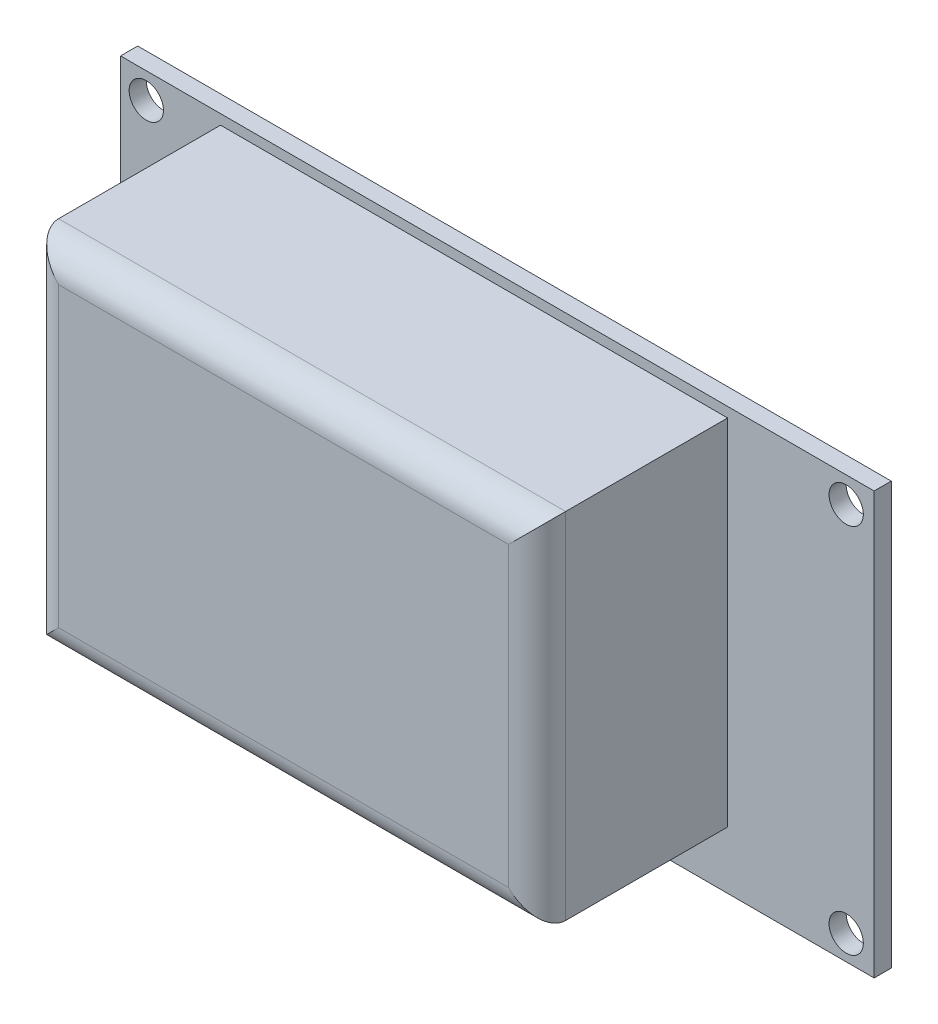
ISO-10303-21;
HEADER;
FILE_DESCRIPTION(('STEP AP214'),'2;1');
FILE_NAME('part.step','',(''),(''),'','','');
FILE_SCHEMA(('AUTOMOTIVE_DESIGN { 1 0 10303 214 1 1 1 1 }'));
ENDSEC;
DATA;
#1=APPLICATION_CONTEXT('core data for automotive mechanical design processes');
#2=APPLICATION_PROTOCOL_DEFINITION('international standard','automotive_design',2000,#1);
#3=PRODUCT_CONTEXT('',#1,'mechanical');
#4=PRODUCT('Part','Part','',(#3));
#5=PRODUCT_RELATED_PRODUCT_CATEGORY('part','',(#4));
#6=PRODUCT_DEFINITION_FORMATION('','',#4);
#7=PRODUCT_DEFINITION_CONTEXT('part definition',#1,'design');
#8=PRODUCT_DEFINITION('design','',#6,#7);
#9=PRODUCT_DEFINITION_SHAPE('','',#8);
#10=(LENGTH_UNIT() NAMED_UNIT(*) SI_UNIT(.MILLI.,.METRE.));
#11=(NAMED_UNIT(*) PLANE_ANGLE_UNIT() SI_UNIT($,.RADIAN.));
#12=(NAMED_UNIT(*) SI_UNIT($,.STERADIAN.) SOLID_ANGLE_UNIT());
#13=UNCERTAINTY_MEASURE_WITH_UNIT(LENGTH_MEASURE(1.E-05),#10,'distance_accuracy_value','');
#14=(GEOMETRIC_REPRESENTATION_CONTEXT(3) GLOBAL_UNCERTAINTY_ASSIGNED_CONTEXT((#13)) GLOBAL_UNIT_ASSIGNED_CONTEXT((#10,
#11,#12)) REPRESENTATION_CONTEXT('',''));
#15=CARTESIAN_POINT('',(0.,0.,0.));
#16=DIRECTION('',(0.,0.,1.));
#17=DIRECTION('',(1.,0.,0.));
#18=AXIS2_PLACEMENT_3D('',#15,#16,#17);
#19=CARTESIAN_POINT('',(-33.5,-18.749999965,1.524));
#20=DIRECTION('',(0.,0.,1.));
#21=DIRECTION('',(1.,0.,0.));
#22=AXIS2_PLACEMENT_3D('',#19,#20,#21);
#23=PLANE('',#22);
#24=DIRECTION('',(0.,-1.,0.));
#25=VECTOR('',#24,1.);
#26=CARTESIAN_POINT('',(-33.5,18.749999965,1.524));
#27=LINE('',#26,#25);
#28=CARTESIAN_POINT('',(-33.5,18.749999965,1.524));
#29=VERTEX_POINT('',#28);
#30=CARTESIAN_POINT('',(-33.5,-18.749999965,1.524));
#31=VERTEX_POINT('',#30);
#32=EDGE_CURVE('E169',#29,#31,#27,.T.);
#33=ORIENTED_EDGE('',*,*,#32,.T.);
#34=DIRECTION('',(1.,0.,0.));
#35=VECTOR('',#34,1.);
#36=CARTESIAN_POINT('',(-33.5,-18.749999965,1.524));
#37=LINE('',#36,#35);
#38=CARTESIAN_POINT('',(33.5,-18.749999965,1.524));
#39=VERTEX_POINT('',#38);
#40=EDGE_CURVE('E172',#31,#39,#37,.T.);
#41=ORIENTED_EDGE('',*,*,#40,.T.);
#42=DIRECTION('',(0.,1.,0.));
#43=VECTOR('',#42,1.);
#44=CARTESIAN_POINT('',(33.5,18.749999965,1.524));
#45=LINE('',#44,#43);
#46=CARTESIAN_POINT('',(33.5,18.749999965,1.524));
#47=VERTEX_POINT('',#46);
#48=EDGE_CURVE('E175',#39,#47,#45,.T.);
#49=ORIENTED_EDGE('',*,*,#48,.T.);
#50=DIRECTION('',(-1.,0.,0.));
#51=VECTOR('',#50,1.);
#52=CARTESIAN_POINT('',(-33.5,18.749999965,1.524));
#53=LINE('',#52,#51);
#54=EDGE_CURVE('E177',#47,#29,#53,.T.);
#55=ORIENTED_EDGE('',*,*,#54,.T.);
#56=EDGE_LOOP('',(#33,#41,#49,#55));
#57=FACE_BOUND('',#56,.T.);
#58=CARTESIAN_POINT('',(-31.214,16.463999965,1.524));
#59=DIRECTION('',(0.,0.,1.));
#60=DIRECTION('',(1.,0.,0.));
#61=AXIS2_PLACEMENT_3D('',#58,#59,#60);
#62=CIRCLE('',#61,1.524);
#63=CARTESIAN_POINT('',(-29.69,16.463999965,1.524));
#64=VERTEX_POINT('',#63);
#65=EDGE_CURVE('E160',#64,#64,#62,.T.);
#66=ORIENTED_EDGE('',*,*,#65,.F.);
#67=EDGE_LOOP('',(#66));
#68=FACE_BOUND('',#67,.T.);
#69=CARTESIAN_POINT('',(31.016,16.463999965,1.524));
#70=DIRECTION('',(0.,0.,1.));
#71=DIRECTION('',(1.,0.,0.));
#72=AXIS2_PLACEMENT_3D('',#69,#70,#71);
#73=CIRCLE('',#72,1.524);
#74=CARTESIAN_POINT('',(32.54,16.463999965,1.524));
#75=VERTEX_POINT('',#74);
#76=EDGE_CURVE('E154',#75,#75,#73,.T.);
#77=ORIENTED_EDGE('',*,*,#76,.F.);
#78=EDGE_LOOP('',(#77));
#79=FACE_BOUND('',#78,.T.);
#80=CARTESIAN_POINT('',(-31.2139999999996,-16.556000035,1.524));
#81=DIRECTION('',(0.,0.,1.));
#82=DIRECTION('',(1.,0.,0.));
#83=AXIS2_PLACEMENT_3D('',#80,#81,#82);
#84=CIRCLE('',#83,1.524);
#85=CARTESIAN_POINT('',(-29.6899999999996,-16.556000035,1.524));
#86=VERTEX_POINT('',#85);
#87=EDGE_CURVE('E148',#86,#86,#84,.T.);
#88=ORIENTED_EDGE('',*,*,#87,.F.);
#89=EDGE_LOOP('',(#88));
#90=FACE_BOUND('',#89,.T.);
#91=CARTESIAN_POINT('',(31.0160000000004,-16.556000035,1.524));
#92=DIRECTION('',(0.,0.,1.));
#93=DIRECTION('',(1.,0.,0.));
#94=AXIS2_PLACEMENT_3D('',#91,#92,#93);
#95=CIRCLE('',#94,1.524);
#96=CARTESIAN_POINT('',(32.5400000000004,-16.556000035,1.524));
#97=VERTEX_POINT('',#96);
#98=EDGE_CURVE('E123',#97,#97,#95,.T.);
#99=ORIENTED_EDGE('',*,*,#98,.F.);
#100=EDGE_LOOP('',(#99));
#101=FACE_BOUND('',#100,.T.);
#102=DIRECTION('',(1.,0.,0.));
#103=VECTOR('',#102,1.);
#104=CARTESIAN_POINT('',(-24.61,-13.635000035,1.524));
#105=LINE('',#104,#103);
#106=CARTESIAN_POINT('',(-24.61,-13.635000035,1.524));
#107=VERTEX_POINT('',#106);
#108=CARTESIAN_POINT('',(20.475,-13.635000035,1.524));
#109=VERTEX_POINT('',#108);
#110=EDGE_CURVE('E116',#107,#109,#105,.T.);
#111=ORIENTED_EDGE('',*,*,#110,.F.);
#112=DIRECTION('',(0.,-1.,0.));
#113=VECTOR('',#112,1.);
#114=CARTESIAN_POINT('',(-24.61,17.860999965,1.524));
#115=LINE('',#114,#113);
#116=CARTESIAN_POINT('',(-24.61,17.860999965,1.524));
#117=VERTEX_POINT('',#116);
#118=EDGE_CURVE('E127',#117,#107,#115,.T.);
#119=ORIENTED_EDGE('',*,*,#118,.F.);
#120=DIRECTION('',(-1.,0.,0.));
#121=VECTOR('',#120,1.);
#122=CARTESIAN_POINT('',(-24.61,17.860999965,1.524));
#123=LINE('',#122,#121);
#124=CARTESIAN_POINT('',(20.475,17.860999965,1.524));
#125=VERTEX_POINT('',#124);
#126=EDGE_CURVE('E137',#125,#117,#123,.T.);
#127=ORIENTED_EDGE('',*,*,#126,.F.);
#128=DIRECTION('',(0.,1.,0.));
#129=VECTOR('',#128,1.);
#130=CARTESIAN_POINT('',(20.475,17.860999965,1.524));
#131=LINE('',#130,#129);
#132=EDGE_CURVE('E135',#109,#125,#131,.T.);
#133=ORIENTED_EDGE('',*,*,#132,.F.);
#134=EDGE_LOOP('',(#111,#119,#127,#133));
#135=FACE_BOUND('',#134,.T.);
#136=ADVANCED_FACE('F35',(#57,#68,#79,#90,#101,#135),#23,.T.);
#137=CARTESIAN_POINT('',(-33.5,18.749999965,1.524));
#138=DIRECTION('',(1.,0.,0.));
#139=DIRECTION('',(0.,1.,0.));
#140=AXIS2_PLACEMENT_3D('',#137,#138,#139);
#141=PLANE('',#140);
#142=DIRECTION('',(0.,-1.,0.));
#143=VECTOR('',#142,1.);
#144=CARTESIAN_POINT('',(-33.5,18.749999965,0.));
#145=LINE('',#144,#143);
#146=CARTESIAN_POINT('',(-33.5,18.749999965,0.));
#147=VERTEX_POINT('',#146);
#148=CARTESIAN_POINT('',(-33.5,-18.749999965,0.));
#149=VERTEX_POINT('',#148);
#150=EDGE_CURVE('E166',#147,#149,#145,.T.);
#151=ORIENTED_EDGE('',*,*,#150,.T.);
#152=DIRECTION('',(0.,0.,-1.));
#153=VECTOR('',#152,1.);
#154=CARTESIAN_POINT('',(-33.5,-18.749999965,1.524));
#155=LINE('',#154,#153);
#156=EDGE_CURVE('E195',#31,#149,#155,.T.);
#157=ORIENTED_EDGE('',*,*,#156,.F.);
#158=ORIENTED_EDGE('',*,*,#32,.F.);
#159=DIRECTION('',(0.,0.,-1.));
#160=VECTOR('',#159,1.);
#161=CARTESIAN_POINT('',(-33.5,18.749999965,1.524));
#162=LINE('',#161,#160);
#163=EDGE_CURVE('E179',#29,#147,#162,.T.);
#164=ORIENTED_EDGE('',*,*,#163,.T.);
#165=EDGE_LOOP('',(#151,#157,#158,#164));
#166=FACE_BOUND('',#165,.T.);
#167=ADVANCED_FACE('F244',(#166),#141,.F.);
#168=CARTESIAN_POINT('',(-33.5,-18.749999965,1.524));
#169=DIRECTION('',(0.,1.,0.));
#170=DIRECTION('',(-1.,0.,0.));
#171=AXIS2_PLACEMENT_3D('',#168,#169,#170);
#172=PLANE('',#171);
#173=DIRECTION('',(1.,0.,0.));
#174=VECTOR('',#173,1.);
#175=CARTESIAN_POINT('',(-33.5,-18.749999965,0.));
#176=LINE('',#175,#174);
#177=CARTESIAN_POINT('',(33.5,-18.749999965,0.));
#178=VERTEX_POINT('',#177);
#179=EDGE_CURVE('E182',#149,#178,#176,.T.);
#180=ORIENTED_EDGE('',*,*,#179,.T.);
#181=DIRECTION('',(0.,0.,-1.));
#182=VECTOR('',#181,1.);
#183=CARTESIAN_POINT('',(33.5,-18.749999965,1.524));
#184=LINE('',#183,#182);
#185=EDGE_CURVE('E192',#39,#178,#184,.T.);
#186=ORIENTED_EDGE('',*,*,#185,.F.);
#187=ORIENTED_EDGE('',*,*,#40,.F.);
#188=ORIENTED_EDGE('',*,*,#156,.T.);
#189=EDGE_LOOP('',(#180,#186,#187,#188));
#190=FACE_BOUND('',#189,.T.);
#191=ADVANCED_FACE('F250',(#190),#172,.F.);
#192=CARTESIAN_POINT('',(33.5,18.749999965,1.524));
#193=DIRECTION('',(-1.,0.,0.));
#194=DIRECTION('',(0.,0.,1.));
#195=AXIS2_PLACEMENT_3D('',#192,#193,#194);
#196=PLANE('',#195);
#197=DIRECTION('',(0.,1.,0.));
#198=VECTOR('',#197,1.);
#199=CARTESIAN_POINT('',(33.5,18.749999965,0.));
#200=LINE('',#199,#198);
#201=CARTESIAN_POINT('',(33.5,18.749999965,0.));
#202=VERTEX_POINT('',#201);
#203=EDGE_CURVE('E184',#178,#202,#200,.T.);
#204=ORIENTED_EDGE('',*,*,#203,.T.);
#205=DIRECTION('',(0.,0.,-1.));
#206=VECTOR('',#205,1.);
#207=CARTESIAN_POINT('',(33.5,18.749999965,1.524));
#208=LINE('',#207,#206);
#209=EDGE_CURVE('E189',#47,#202,#208,.T.);
#210=ORIENTED_EDGE('',*,*,#209,.F.);
#211=ORIENTED_EDGE('',*,*,#48,.F.);
#212=ORIENTED_EDGE('',*,*,#185,.T.);
#213=EDGE_LOOP('',(#204,#210,#211,#212));
#214=FACE_BOUND('',#213,.T.);
#215=ADVANCED_FACE('F265',(#214),#196,.F.);
#216=CARTESIAN_POINT('',(-33.5,18.749999965,1.524));
#217=DIRECTION('',(0.,-1.,0.));
#218=DIRECTION('',(1.,0.,0.));
#219=AXIS2_PLACEMENT_3D('',#216,#217,#218);
#220=PLANE('',#219);
#221=DIRECTION('',(-1.,0.,0.));
#222=VECTOR('',#221,1.);
#223=CARTESIAN_POINT('',(-33.5,18.749999965,0.));
#224=LINE('',#223,#222);
#225=EDGE_CURVE('E173',#202,#147,#224,.T.);
#226=ORIENTED_EDGE('',*,*,#225,.T.);
#227=ORIENTED_EDGE('',*,*,#163,.F.);
#228=ORIENTED_EDGE('',*,*,#54,.F.);
#229=ORIENTED_EDGE('',*,*,#209,.T.);
#230=EDGE_LOOP('',(#226,#227,#228,#229));
#231=FACE_BOUND('',#230,.T.);
#232=ADVANCED_FACE('F261',(#231),#220,.F.);
#233=CARTESIAN_POINT('',(-33.5,-18.749999965,0.));
#234=DIRECTION('',(0.,0.,1.));
#235=DIRECTION('',(1.,0.,0.));
#236=AXIS2_PLACEMENT_3D('',#233,#234,#235);
#237=PLANE('',#236);
#238=CARTESIAN_POINT('',(31.0160000000004,-16.556000035,0.));
#239=DIRECTION('',(0.,0.,1.));
#240=DIRECTION('',(1.,0.,0.));
#241=AXIS2_PLACEMENT_3D('',#238,#239,#240);
#242=CIRCLE('',#241,1.524);
#243=CARTESIAN_POINT('',(32.5400000000004,-16.556000035,0.));
#244=VERTEX_POINT('',#243);
#245=EDGE_CURVE('E145',#244,#244,#242,.T.);
#246=ORIENTED_EDGE('',*,*,#245,.T.);
#247=EDGE_LOOP('',(#246));
#248=FACE_BOUND('',#247,.T.);
#249=CARTESIAN_POINT('',(-31.2139999999996,-16.556000035,0.));
#250=DIRECTION('',(0.,0.,1.));
#251=DIRECTION('',(1.,0.,0.));
#252=AXIS2_PLACEMENT_3D('',#249,#250,#251);
#253=CIRCLE('',#252,1.524);
#254=CARTESIAN_POINT('',(-29.6899999999996,-16.556000035,0.));
#255=VERTEX_POINT('',#254);
#256=EDGE_CURVE('E151',#255,#255,#253,.T.);
#257=ORIENTED_EDGE('',*,*,#256,.T.);
#258=EDGE_LOOP('',(#257));
#259=FACE_BOUND('',#258,.T.);
#260=CARTESIAN_POINT('',(31.016,16.463999965,0.));
#261=DIRECTION('',(0.,0.,1.));
#262=DIRECTION('',(1.,0.,0.));
#263=AXIS2_PLACEMENT_3D('',#260,#261,#262);
#264=CIRCLE('',#263,1.524);
#265=CARTESIAN_POINT('',(32.54,16.463999965,0.));
#266=VERTEX_POINT('',#265);
#267=EDGE_CURVE('E157',#266,#266,#264,.T.);
#268=ORIENTED_EDGE('',*,*,#267,.T.);
#269=EDGE_LOOP('',(#268));
#270=FACE_BOUND('',#269,.T.);
#271=CARTESIAN_POINT('',(-31.214,16.463999965,0.));
#272=DIRECTION('',(0.,0.,1.));
#273=DIRECTION('',(1.,0.,0.));
#274=AXIS2_PLACEMENT_3D('',#271,#272,#273);
#275=CIRCLE('',#274,1.524);
#276=CARTESIAN_POINT('',(-29.69,16.463999965,0.));
#277=VERTEX_POINT('',#276);
#278=EDGE_CURVE('E163',#277,#277,#275,.T.);
#279=ORIENTED_EDGE('',*,*,#278,.T.);
#280=EDGE_LOOP('',(#279));
#281=FACE_BOUND('',#280,.T.);
#282=ORIENTED_EDGE('',*,*,#150,.F.);
#283=ORIENTED_EDGE('',*,*,#225,.F.);
#284=ORIENTED_EDGE('',*,*,#203,.F.);
#285=ORIENTED_EDGE('',*,*,#179,.F.);
#286=EDGE_LOOP('',(#282,#283,#284,#285));
#287=FACE_BOUND('',#286,.T.);
#288=ADVANCED_FACE('F258',(#248,#259,#270,#281,#287),#237,.F.);
#289=CARTESIAN_POINT('',(-31.214,16.463999965,0.));
#290=DIRECTION('',(0.,0.,1.));
#291=DIRECTION('',(1.,0.,0.));
#292=AXIS2_PLACEMENT_3D('',#289,#290,#291);
#293=CYLINDRICAL_SURFACE('',#292,1.524);
#294=CARTESIAN_POINT('',(-29.69,16.463999965,0.));
#295=CARTESIAN_POINT('',(-29.69,16.463999965,0.015875));
#296=CARTESIAN_POINT('',(-29.69,16.463999965,0.03175));
#297=CARTESIAN_POINT('',(-29.69,16.463999965,0.0635));
#298=CARTESIAN_POINT('',(-29.69,16.463999965,0.079375));
#299=CARTESIAN_POINT('',(-29.69,16.463999965,0.111125));
#300=CARTESIAN_POINT('',(-29.69,16.463999965,0.127));
#301=CARTESIAN_POINT('',(-29.69,16.463999965,0.15875));
#302=CARTESIAN_POINT('',(-29.69,16.463999965,0.174625));
#303=CARTESIAN_POINT('',(-29.69,16.463999965,0.206375));
#304=CARTESIAN_POINT('',(-29.69,16.463999965,0.22225));
#305=CARTESIAN_POINT('',(-29.69,16.463999965,0.254));
#306=CARTESIAN_POINT('',(-29.69,16.463999965,0.269875));
#307=CARTESIAN_POINT('',(-29.69,16.463999965,0.301625));
#308=CARTESIAN_POINT('',(-29.69,16.463999965,0.3175));
#309=CARTESIAN_POINT('',(-29.69,16.463999965,0.34925));
#310=CARTESIAN_POINT('',(-29.69,16.463999965,0.365125));
#311=CARTESIAN_POINT('',(-29.69,16.463999965,0.396875));
#312=CARTESIAN_POINT('',(-29.69,16.463999965,0.41275));
#313=CARTESIAN_POINT('',(-29.69,16.463999965,0.4445));
#314=CARTESIAN_POINT('',(-29.69,16.463999965,0.460375));
#315=CARTESIAN_POINT('',(-29.69,16.463999965,0.492125));
#316=CARTESIAN_POINT('',(-29.69,16.463999965,0.508));
#317=CARTESIAN_POINT('',(-29.69,16.463999965,0.53975));
#318=CARTESIAN_POINT('',(-29.69,16.463999965,0.555625));
#319=CARTESIAN_POINT('',(-29.69,16.463999965,0.587375));
#320=CARTESIAN_POINT('',(-29.69,16.463999965,0.60325));
#321=CARTESIAN_POINT('',(-29.69,16.463999965,0.635));
#322=CARTESIAN_POINT('',(-29.69,16.463999965,0.650875));
#323=CARTESIAN_POINT('',(-29.69,16.463999965,0.682625));
#324=CARTESIAN_POINT('',(-29.69,16.463999965,0.6985));
#325=CARTESIAN_POINT('',(-29.69,16.463999965,0.73025));
#326=CARTESIAN_POINT('',(-29.69,16.463999965,0.746125));
#327=CARTESIAN_POINT('',(-29.69,16.463999965,0.777875));
#328=CARTESIAN_POINT('',(-29.69,16.463999965,0.79375));
#329=CARTESIAN_POINT('',(-29.69,16.463999965,0.8255));
#330=CARTESIAN_POINT('',(-29.69,16.463999965,0.841375));
#331=CARTESIAN_POINT('',(-29.69,16.463999965,0.873125));
#332=CARTESIAN_POINT('',(-29.69,16.463999965,0.889));
#333=CARTESIAN_POINT('',(-29.69,16.463999965,0.92075));
#334=CARTESIAN_POINT('',(-29.69,16.463999965,0.936625));
#335=CARTESIAN_POINT('',(-29.69,16.463999965,0.968375));
#336=CARTESIAN_POINT('',(-29.69,16.463999965,0.98425));
#337=CARTESIAN_POINT('',(-29.69,16.463999965,1.016));
#338=CARTESIAN_POINT('',(-29.69,16.463999965,1.031875));
#339=CARTESIAN_POINT('',(-29.69,16.463999965,1.063625));
#340=CARTESIAN_POINT('',(-29.69,16.463999965,1.0795));
#341=CARTESIAN_POINT('',(-29.69,16.463999965,1.11125));
#342=CARTESIAN_POINT('',(-29.69,16.463999965,1.127125));
#343=CARTESIAN_POINT('',(-29.69,16.463999965,1.158875));
#344=CARTESIAN_POINT('',(-29.69,16.463999965,1.17475));
#345=CARTESIAN_POINT('',(-29.69,16.463999965,1.2065));
#346=CARTESIAN_POINT('',(-29.69,16.463999965,1.222375));
#347=CARTESIAN_POINT('',(-29.69,16.463999965,1.254125));
#348=CARTESIAN_POINT('',(-29.69,16.463999965,1.27));
#349=CARTESIAN_POINT('',(-29.69,16.463999965,1.30175));
#350=CARTESIAN_POINT('',(-29.69,16.463999965,1.317625));
#351=CARTESIAN_POINT('',(-29.69,16.463999965,1.349375));
#352=CARTESIAN_POINT('',(-29.69,16.463999965,1.36525));
#353=CARTESIAN_POINT('',(-29.69,16.463999965,1.397));
#354=CARTESIAN_POINT('',(-29.69,16.463999965,1.412875));
#355=CARTESIAN_POINT('',(-29.69,16.463999965,1.444625));
#356=CARTESIAN_POINT('',(-29.69,16.463999965,1.4605));
#357=CARTESIAN_POINT('',(-29.69,16.463999965,1.49225));
#358=CARTESIAN_POINT('',(-29.69,16.463999965,1.508125));
#359=CARTESIAN_POINT('',(-29.69,16.463999965,1.524));
#360=B_SPLINE_CURVE_WITH_KNOTS('',3,(#294,#295,#296,#297,#298,#299,#300,#301,#302,#303,#304,
#305,#306,#307,#308,#309,#310,#311,#312,#313,#314,#315,#316,#317,#318,#319,#320,#321,#322,#323,
#324,#325,#326,#327,#328,#329,#330,#331,#332,#333,#334,#335,#336,#337,#338,#339,#340,#341,#342,
#343,#344,#345,#346,#347,#348,#349,#350,#351,#352,#353,#354,#355,#356,#357,#358,#359),
.UNSPECIFIED.,.F.,.F.,(4,2,2,2,2,2,2,2,2,2,2,2,2,2,2,2,2,2,2,2,2,2,2,2,2,2,2,2,2,2,2,2,4),(0.,
0.047625,0.09525,0.142875,0.1905,0.238125,0.28575,0.333375,0.381,0.428625,0.47625,0.523875,
0.5715,0.619125,0.66675,0.714375,0.762,0.809625,0.85725,0.904875,0.9525,1.000125,1.04775,
1.095375,1.143,1.190625,1.23825,1.285875,1.3335,1.381125,1.42875,1.476375,1.524),.UNSPECIFIED.);
#361=EDGE_CURVE('BSEAM256',#277,#64,#360,.T.);
#362=ORIENTED_EDGE('',*,*,#278,.F.);
#363=ORIENTED_EDGE('',*,*,#65,.T.);
#364=ORIENTED_EDGE('',*,*,#361,.T.);
#365=ORIENTED_EDGE('',*,*,#361,.F.);
#366=EDGE_LOOP('',(#362,#364,#363,#365));
#367=FACE_BOUND('',#366,.T.);
#368=ADVANCED_FACE('F256',(#367),#293,.F.);
#369=CARTESIAN_POINT('',(31.016,16.463999965,0.));
#370=DIRECTION('',(0.,0.,1.));
#371=DIRECTION('',(1.,0.,0.));
#372=AXIS2_PLACEMENT_3D('',#369,#370,#371);
#373=CYLINDRICAL_SURFACE('',#372,1.524);
#374=CARTESIAN_POINT('',(32.54,16.463999965,0.));
#375=CARTESIAN_POINT('',(32.54,16.463999965,0.015875));
#376=CARTESIAN_POINT('',(32.54,16.463999965,0.03175));
#377=CARTESIAN_POINT('',(32.54,16.463999965,0.0635));
#378=CARTESIAN_POINT('',(32.54,16.463999965,0.079375));
#379=CARTESIAN_POINT('',(32.54,16.463999965,0.111125));
#380=CARTESIAN_POINT('',(32.54,16.463999965,0.127));
#381=CARTESIAN_POINT('',(32.54,16.463999965,0.15875));
#382=CARTESIAN_POINT('',(32.54,16.463999965,0.174625));
#383=CARTESIAN_POINT('',(32.54,16.463999965,0.206375));
#384=CARTESIAN_POINT('',(32.54,16.463999965,0.22225));
#385=CARTESIAN_POINT('',(32.54,16.463999965,0.254));
#386=CARTESIAN_POINT('',(32.54,16.463999965,0.269875));
#387=CARTESIAN_POINT('',(32.54,16.463999965,0.301625));
#388=CARTESIAN_POINT('',(32.54,16.463999965,0.3175));
#389=CARTESIAN_POINT('',(32.54,16.463999965,0.34925));
#390=CARTESIAN_POINT('',(32.54,16.463999965,0.365125));
#391=CARTESIAN_POINT('',(32.54,16.463999965,0.396875));
#392=CARTESIAN_POINT('',(32.54,16.463999965,0.41275));
#393=CARTESIAN_POINT('',(32.54,16.463999965,0.4445));
#394=CARTESIAN_POINT('',(32.54,16.463999965,0.460375));
#395=CARTESIAN_POINT('',(32.54,16.463999965,0.492125));
#396=CARTESIAN_POINT('',(32.54,16.463999965,0.508));
#397=CARTESIAN_POINT('',(32.54,16.463999965,0.53975));
#398=CARTESIAN_POINT('',(32.54,16.463999965,0.555625));
#399=CARTESIAN_POINT('',(32.54,16.463999965,0.587375));
#400=CARTESIAN_POINT('',(32.54,16.463999965,0.60325));
#401=CARTESIAN_POINT('',(32.54,16.463999965,0.635));
#402=CARTESIAN_POINT('',(32.54,16.463999965,0.650875));
#403=CARTESIAN_POINT('',(32.54,16.463999965,0.682625));
#404=CARTESIAN_POINT('',(32.54,16.463999965,0.6985));
#405=CARTESIAN_POINT('',(32.54,16.463999965,0.73025));
#406=CARTESIAN_POINT('',(32.54,16.463999965,0.746125));
#407=CARTESIAN_POINT('',(32.54,16.463999965,0.777875));
#408=CARTESIAN_POINT('',(32.54,16.463999965,0.79375));
#409=CARTESIAN_POINT('',(32.54,16.463999965,0.8255));
#410=CARTESIAN_POINT('',(32.54,16.463999965,0.841375));
#411=CARTESIAN_POINT('',(32.54,16.463999965,0.873125));
#412=CARTESIAN_POINT('',(32.54,16.463999965,0.889));
#413=CARTESIAN_POINT('',(32.54,16.463999965,0.92075));
#414=CARTESIAN_POINT('',(32.54,16.463999965,0.936625));
#415=CARTESIAN_POINT('',(32.54,16.463999965,0.968375));
#416=CARTESIAN_POINT('',(32.54,16.463999965,0.98425));
#417=CARTESIAN_POINT('',(32.54,16.463999965,1.016));
#418=CARTESIAN_POINT('',(32.54,16.463999965,1.031875));
#419=CARTESIAN_POINT('',(32.54,16.463999965,1.063625));
#420=CARTESIAN_POINT('',(32.54,16.463999965,1.0795));
#421=CARTESIAN_POINT('',(32.54,16.463999965,1.11125));
#422=CARTESIAN_POINT('',(32.54,16.463999965,1.127125));
#423=CARTESIAN_POINT('',(32.54,16.463999965,1.158875));
#424=CARTESIAN_POINT('',(32.54,16.463999965,1.17475));
#425=CARTESIAN_POINT('',(32.54,16.463999965,1.2065));
#426=CARTESIAN_POINT('',(32.54,16.463999965,1.222375));
#427=CARTESIAN_POINT('',(32.54,16.463999965,1.254125));
#428=CARTESIAN_POINT('',(32.54,16.463999965,1.27));
#429=CARTESIAN_POINT('',(32.54,16.463999965,1.30175));
#430=CARTESIAN_POINT('',(32.54,16.463999965,1.317625));
#431=CARTESIAN_POINT('',(32.54,16.463999965,1.349375));
#432=CARTESIAN_POINT('',(32.54,16.463999965,1.36525));
#433=CARTESIAN_POINT('',(32.54,16.463999965,1.397));
#434=CARTESIAN_POINT('',(32.54,16.463999965,1.412875));
#435=CARTESIAN_POINT('',(32.54,16.463999965,1.444625));
#436=CARTESIAN_POINT('',(32.54,16.463999965,1.4605));
#437=CARTESIAN_POINT('',(32.54,16.463999965,1.49225));
#438=CARTESIAN_POINT('',(32.54,16.463999965,1.508125));
#439=CARTESIAN_POINT('',(32.54,16.463999965,1.524));
#440=B_SPLINE_CURVE_WITH_KNOTS('',3,(#374,#375,#376,#377,#378,#379,#380,#381,#382,#383,#384,
#385,#386,#387,#388,#389,#390,#391,#392,#393,#394,#395,#396,#397,#398,#399,#400,#401,#402,#403,
#404,#405,#406,#407,#408,#409,#410,#411,#412,#413,#414,#415,#416,#417,#418,#419,#420,#421,#422,
#423,#424,#425,#426,#427,#428,#429,#430,#431,#432,#433,#434,#435,#436,#437,#438,#439),
.UNSPECIFIED.,.F.,.F.,(4,2,2,2,2,2,2,2,2,2,2,2,2,2,2,2,2,2,2,2,2,2,2,2,2,2,2,2,2,2,2,2,4),(0.,
0.047625,0.09525,0.142875,0.1905,0.238125,0.28575,0.333375,0.381,0.428625,0.47625,0.523875,
0.5715,0.619125,0.66675,0.714375,0.762,0.809625,0.85725,0.904875,0.9525,1.000125,1.04775,
1.095375,1.143,1.190625,1.23825,1.285875,1.3335,1.381125,1.42875,1.476375,1.524),.UNSPECIFIED.);
#441=EDGE_CURVE('BSEAM335',#266,#75,#440,.T.);
#442=ORIENTED_EDGE('',*,*,#267,.F.);
#443=ORIENTED_EDGE('',*,*,#76,.T.);
#444=ORIENTED_EDGE('',*,*,#441,.T.);
#445=ORIENTED_EDGE('',*,*,#441,.F.);
#446=EDGE_LOOP('',(#442,#444,#443,#445));
#447=FACE_BOUND('',#446,.T.);
#448=ADVANCED_FACE('F335',(#447),#373,.F.);
#449=CARTESIAN_POINT('',(-31.2139999999996,-16.556000035,0.));
#450=DIRECTION('',(0.,0.,1.));
#451=DIRECTION('',(1.,0.,0.));
#452=AXIS2_PLACEMENT_3D('',#449,#450,#451);
#453=CYLINDRICAL_SURFACE('',#452,1.524);
#454=CARTESIAN_POINT('',(-29.6899999999996,-16.556000035,0.));
#455=CARTESIAN_POINT('',(-29.6899999999996,-16.556000035,0.015875));
#456=CARTESIAN_POINT('',(-29.6899999999996,-16.556000035,0.03175));
#457=CARTESIAN_POINT('',(-29.6899999999996,-16.556000035,0.0635));
#458=CARTESIAN_POINT('',(-29.6899999999996,-16.556000035,0.079375));
#459=CARTESIAN_POINT('',(-29.6899999999996,-16.556000035,0.111125));
#460=CARTESIAN_POINT('',(-29.6899999999996,-16.556000035,0.127));
#461=CARTESIAN_POINT('',(-29.6899999999996,-16.556000035,0.15875));
#462=CARTESIAN_POINT('',(-29.6899999999996,-16.556000035,0.174625));
#463=CARTESIAN_POINT('',(-29.6899999999996,-16.556000035,0.206375));
#464=CARTESIAN_POINT('',(-29.6899999999996,-16.556000035,0.22225));
#465=CARTESIAN_POINT('',(-29.6899999999996,-16.556000035,0.254));
#466=CARTESIAN_POINT('',(-29.6899999999996,-16.556000035,0.269875));
#467=CARTESIAN_POINT('',(-29.6899999999996,-16.556000035,0.301625));
#468=CARTESIAN_POINT('',(-29.6899999999996,-16.556000035,0.3175));
#469=CARTESIAN_POINT('',(-29.6899999999996,-16.556000035,0.34925));
#470=CARTESIAN_POINT('',(-29.6899999999996,-16.556000035,0.365125));
#471=CARTESIAN_POINT('',(-29.6899999999996,-16.556000035,0.396875));
#472=CARTESIAN_POINT('',(-29.6899999999996,-16.556000035,0.41275));
#473=CARTESIAN_POINT('',(-29.6899999999996,-16.556000035,0.4445));
#474=CARTESIAN_POINT('',(-29.6899999999996,-16.556000035,0.460375));
#475=CARTESIAN_POINT('',(-29.6899999999996,-16.556000035,0.492125));
#476=CARTESIAN_POINT('',(-29.6899999999996,-16.556000035,0.508));
#477=CARTESIAN_POINT('',(-29.6899999999996,-16.556000035,0.53975));
#478=CARTESIAN_POINT('',(-29.6899999999996,-16.556000035,0.555625));
#479=CARTESIAN_POINT('',(-29.6899999999996,-16.556000035,0.587375));
#480=CARTESIAN_POINT('',(-29.6899999999996,-16.556000035,0.60325));
#481=CARTESIAN_POINT('',(-29.6899999999996,-16.556000035,0.635));
#482=CARTESIAN_POINT('',(-29.6899999999996,-16.556000035,0.650875));
#483=CARTESIAN_POINT('',(-29.6899999999996,-16.556000035,0.682625));
#484=CARTESIAN_POINT('',(-29.6899999999996,-16.556000035,0.6985));
#485=CARTESIAN_POINT('',(-29.6899999999996,-16.556000035,0.73025));
#486=CARTESIAN_POINT('',(-29.6899999999996,-16.556000035,0.746125));
#487=CARTESIAN_POINT('',(-29.6899999999996,-16.556000035,0.777875));
#488=CARTESIAN_POINT('',(-29.6899999999996,-16.556000035,0.79375));
#489=CARTESIAN_POINT('',(-29.6899999999996,-16.556000035,0.8255));
#490=CARTESIAN_POINT('',(-29.6899999999996,-16.556000035,0.841375));
#491=CARTESIAN_POINT('',(-29.6899999999996,-16.556000035,0.873125));
#492=CARTESIAN_POINT('',(-29.6899999999996,-16.556000035,0.889));
#493=CARTESIAN_POINT('',(-29.6899999999996,-16.556000035,0.92075));
#494=CARTESIAN_POINT('',(-29.6899999999996,-16.556000035,0.936625));
#495=CARTESIAN_POINT('',(-29.6899999999996,-16.556000035,0.968375));
#496=CARTESIAN_POINT('',(-29.6899999999996,-16.556000035,0.98425));
#497=CARTESIAN_POINT('',(-29.6899999999996,-16.556000035,1.016));
#498=CARTESIAN_POINT('',(-29.6899999999996,-16.556000035,1.031875));
#499=CARTESIAN_POINT('',(-29.6899999999996,-16.556000035,1.063625));
#500=CARTESIAN_POINT('',(-29.6899999999996,-16.556000035,1.0795));
#501=CARTESIAN_POINT('',(-29.6899999999996,-16.556000035,1.11125));
#502=CARTESIAN_POINT('',(-29.6899999999996,-16.556000035,1.127125));
#503=CARTESIAN_POINT('',(-29.6899999999996,-16.556000035,1.158875));
#504=CARTESIAN_POINT('',(-29.6899999999996,-16.556000035,1.17475));
#505=CARTESIAN_POINT('',(-29.6899999999996,-16.556000035,1.2065));
#506=CARTESIAN_POINT('',(-29.6899999999996,-16.556000035,1.222375));
#507=CARTESIAN_POINT('',(-29.6899999999996,-16.556000035,1.254125));
#508=CARTESIAN_POINT('',(-29.6899999999996,-16.556000035,1.27));
#509=CARTESIAN_POINT('',(-29.6899999999996,-16.556000035,1.30175));
#510=CARTESIAN_POINT('',(-29.6899999999996,-16.556000035,1.317625));
#511=CARTESIAN_POINT('',(-29.6899999999996,-16.556000035,1.349375));
#512=CARTESIAN_POINT('',(-29.6899999999996,-16.556000035,1.36525));
#513=CARTESIAN_POINT('',(-29.6899999999996,-16.556000035,1.397));
#514=CARTESIAN_POINT('',(-29.6899999999996,-16.556000035,1.412875));
#515=CARTESIAN_POINT('',(-29.6899999999996,-16.556000035,1.444625));
#516=CARTESIAN_POINT('',(-29.6899999999996,-16.556000035,1.4605));
#517=CARTESIAN_POINT('',(-29.6899999999996,-16.556000035,1.49225));
#518=CARTESIAN_POINT('',(-29.6899999999996,-16.556000035,1.508125));
#519=CARTESIAN_POINT('',(-29.6899999999996,-16.556000035,1.524));
#520=B_SPLINE_CURVE_WITH_KNOTS('',3,(#454,#455,#456,#457,#458,#459,#460,#461,#462,#463,#464,
#465,#466,#467,#468,#469,#470,#471,#472,#473,#474,#475,#476,#477,#478,#479,#480,#481,#482,#483,
#484,#485,#486,#487,#488,#489,#490,#491,#492,#493,#494,#495,#496,#497,#498,#499,#500,#501,#502,
#503,#504,#505,#506,#507,#508,#509,#510,#511,#512,#513,#514,#515,#516,#517,#518,#519),
.UNSPECIFIED.,.F.,.F.,(4,2,2,2,2,2,2,2,2,2,2,2,2,2,2,2,2,2,2,2,2,2,2,2,2,2,2,2,2,2,2,2,4),(0.,
0.047625,0.09525,0.142875,0.1905,0.238125,0.28575,0.333375,0.381,0.428625,0.47625,0.523875,
0.5715,0.619125,0.66675,0.714375,0.762,0.809625,0.85725,0.904875,0.9525,1.000125,1.04775,
1.095375,1.143,1.190625,1.23825,1.285875,1.3335,1.381125,1.42875,1.476375,1.524),.UNSPECIFIED.);
#521=EDGE_CURVE('BSEAM325',#255,#86,#520,.T.);
#522=ORIENTED_EDGE('',*,*,#256,.F.);
#523=ORIENTED_EDGE('',*,*,#87,.T.);
#524=ORIENTED_EDGE('',*,*,#521,.T.);
#525=ORIENTED_EDGE('',*,*,#521,.F.);
#526=EDGE_LOOP('',(#522,#524,#523,#525));
#527=FACE_BOUND('',#526,.T.);
#528=ADVANCED_FACE('F325',(#527),#453,.F.);
#529=CARTESIAN_POINT('',(31.0160000000004,-16.556000035,0.));
#530=DIRECTION('',(0.,0.,1.));
#531=DIRECTION('',(1.,0.,0.));
#532=AXIS2_PLACEMENT_3D('',#529,#530,#531);
#533=CYLINDRICAL_SURFACE('',#532,1.524);
#534=CARTESIAN_POINT('',(32.5400000000004,-16.556000035,0.));
#535=CARTESIAN_POINT('',(32.5400000000004,-16.556000035,0.015875));
#536=CARTESIAN_POINT('',(32.5400000000004,-16.556000035,0.03175));
#537=CARTESIAN_POINT('',(32.5400000000004,-16.556000035,0.0635));
#538=CARTESIAN_POINT('',(32.5400000000004,-16.556000035,0.079375));
#539=CARTESIAN_POINT('',(32.5400000000004,-16.556000035,0.111125));
#540=CARTESIAN_POINT('',(32.5400000000004,-16.556000035,0.127));
#541=CARTESIAN_POINT('',(32.5400000000004,-16.556000035,0.15875));
#542=CARTESIAN_POINT('',(32.5400000000004,-16.556000035,0.174625));
#543=CARTESIAN_POINT('',(32.5400000000004,-16.556000035,0.206375));
#544=CARTESIAN_POINT('',(32.5400000000004,-16.556000035,0.22225));
#545=CARTESIAN_POINT('',(32.5400000000004,-16.556000035,0.254));
#546=CARTESIAN_POINT('',(32.5400000000004,-16.556000035,0.269875));
#547=CARTESIAN_POINT('',(32.5400000000004,-16.556000035,0.301625));
#548=CARTESIAN_POINT('',(32.5400000000004,-16.556000035,0.3175));
#549=CARTESIAN_POINT('',(32.5400000000004,-16.556000035,0.34925));
#550=CARTESIAN_POINT('',(32.5400000000004,-16.556000035,0.365125));
#551=CARTESIAN_POINT('',(32.5400000000004,-16.556000035,0.396875));
#552=CARTESIAN_POINT('',(32.5400000000004,-16.556000035,0.41275));
#553=CARTESIAN_POINT('',(32.5400000000004,-16.556000035,0.4445));
#554=CARTESIAN_POINT('',(32.5400000000004,-16.556000035,0.460375));
#555=CARTESIAN_POINT('',(32.5400000000004,-16.556000035,0.492125));
#556=CARTESIAN_POINT('',(32.5400000000004,-16.556000035,0.508));
#557=CARTESIAN_POINT('',(32.5400000000004,-16.556000035,0.53975));
#558=CARTESIAN_POINT('',(32.5400000000004,-16.556000035,0.555625));
#559=CARTESIAN_POINT('',(32.5400000000004,-16.556000035,0.587375));
#560=CARTESIAN_POINT('',(32.5400000000004,-16.556000035,0.60325));
#561=CARTESIAN_POINT('',(32.5400000000004,-16.556000035,0.635));
#562=CARTESIAN_POINT('',(32.5400000000004,-16.556000035,0.650875));
#563=CARTESIAN_POINT('',(32.5400000000004,-16.556000035,0.682625));
#564=CARTESIAN_POINT('',(32.5400000000004,-16.556000035,0.6985));
#565=CARTESIAN_POINT('',(32.5400000000004,-16.556000035,0.73025));
#566=CARTESIAN_POINT('',(32.5400000000004,-16.556000035,0.746125));
#567=CARTESIAN_POINT('',(32.5400000000004,-16.556000035,0.777875));
#568=CARTESIAN_POINT('',(32.5400000000004,-16.556000035,0.79375));
#569=CARTESIAN_POINT('',(32.5400000000004,-16.556000035,0.8255));
#570=CARTESIAN_POINT('',(32.5400000000004,-16.556000035,0.841375));
#571=CARTESIAN_POINT('',(32.5400000000004,-16.556000035,0.873125));
#572=CARTESIAN_POINT('',(32.5400000000004,-16.556000035,0.889));
#573=CARTESIAN_POINT('',(32.5400000000004,-16.556000035,0.92075));
#574=CARTESIAN_POINT('',(32.5400000000004,-16.556000035,0.936625));
#575=CARTESIAN_POINT('',(32.5400000000004,-16.556000035,0.968375));
#576=CARTESIAN_POINT('',(32.5400000000004,-16.556000035,0.98425));
#577=CARTESIAN_POINT('',(32.5400000000004,-16.556000035,1.016));
#578=CARTESIAN_POINT('',(32.5400000000004,-16.556000035,1.031875));
#579=CARTESIAN_POINT('',(32.5400000000004,-16.556000035,1.063625));
#580=CARTESIAN_POINT('',(32.5400000000004,-16.556000035,1.0795));
#581=CARTESIAN_POINT('',(32.5400000000004,-16.556000035,1.11125));
#582=CARTESIAN_POINT('',(32.5400000000004,-16.556000035,1.127125));
#583=CARTESIAN_POINT('',(32.5400000000004,-16.556000035,1.158875));
#584=CARTESIAN_POINT('',(32.5400000000004,-16.556000035,1.17475));
#585=CARTESIAN_POINT('',(32.5400000000004,-16.556000035,1.2065));
#586=CARTESIAN_POINT('',(32.5400000000004,-16.556000035,1.222375));
#587=CARTESIAN_POINT('',(32.5400000000004,-16.556000035,1.254125));
#588=CARTESIAN_POINT('',(32.5400000000004,-16.556000035,1.27));
#589=CARTESIAN_POINT('',(32.5400000000004,-16.556000035,1.30175));
#590=CARTESIAN_POINT('',(32.5400000000004,-16.556000035,1.317625));
#591=CARTESIAN_POINT('',(32.5400000000004,-16.556000035,1.349375));
#592=CARTESIAN_POINT('',(32.5400000000004,-16.556000035,1.36525));
#593=CARTESIAN_POINT('',(32.5400000000004,-16.556000035,1.397));
#594=CARTESIAN_POINT('',(32.5400000000004,-16.556000035,1.412875));
#595=CARTESIAN_POINT('',(32.5400000000004,-16.556000035,1.444625));
#596=CARTESIAN_POINT('',(32.5400000000004,-16.556000035,1.4605));
#597=CARTESIAN_POINT('',(32.5400000000004,-16.556000035,1.49225));
#598=CARTESIAN_POINT('',(32.5400000000004,-16.556000035,1.508125));
#599=CARTESIAN_POINT('',(32.5400000000004,-16.556000035,1.524));
#600=B_SPLINE_CURVE_WITH_KNOTS('',3,(#534,#535,#536,#537,#538,#539,#540,#541,#542,#543,#544,
#545,#546,#547,#548,#549,#550,#551,#552,#553,#554,#555,#556,#557,#558,#559,#560,#561,#562,#563,
#564,#565,#566,#567,#568,#569,#570,#571,#572,#573,#574,#575,#576,#577,#578,#579,#580,#581,#582,
#583,#584,#585,#586,#587,#588,#589,#590,#591,#592,#593,#594,#595,#596,#597,#598,#599),
.UNSPECIFIED.,.F.,.F.,(4,2,2,2,2,2,2,2,2,2,2,2,2,2,2,2,2,2,2,2,2,2,2,2,2,2,2,2,2,2,2,2,4),(0.,
0.047625,0.09525,0.142875,0.1905,0.238125,0.28575,0.333375,0.381,0.428625,0.47625,0.523875,
0.5715,0.619125,0.66675,0.714375,0.762,0.809625,0.85725,0.904875,0.9525,1.000125,1.04775,
1.095375,1.143,1.190625,1.23825,1.285875,1.3335,1.381125,1.42875,1.476375,1.524),.UNSPECIFIED.);
#601=EDGE_CURVE('BSEAM310',#244,#97,#600,.T.);
#602=ORIENTED_EDGE('',*,*,#245,.F.);
#603=ORIENTED_EDGE('',*,*,#98,.T.);
#604=ORIENTED_EDGE('',*,*,#601,.T.);
#605=ORIENTED_EDGE('',*,*,#601,.F.);
#606=EDGE_LOOP('',(#602,#604,#603,#605));
#607=FACE_BOUND('',#606,.T.);
#608=ADVANCED_FACE('F310',(#607),#533,.F.);
#609=CARTESIAN_POINT('',(-24.61,17.860999965,18.4658));
#610=DIRECTION('',(1.,0.,0.));
#611=DIRECTION('',(0.,1.,0.));
#612=AXIS2_PLACEMENT_3D('',#609,#610,#611);
#613=PLANE('',#612);
#614=DIRECTION('',(0.,0.,-1.));
#615=VECTOR('',#614,1.);
#616=CARTESIAN_POINT('',(-24.61,-13.635000035,18.4658));
#617=LINE('',#616,#615);
#618=CARTESIAN_POINT('',(-24.61,-13.635000035,15.9258));
#619=VERTEX_POINT('',#618);
#620=EDGE_CURVE('E112',#619,#107,#617,.T.);
#621=ORIENTED_EDGE('',*,*,#620,.F.);
#622=DIRECTION('',(0.,-1.,0.));
#623=VECTOR('',#622,1.);
#624=CARTESIAN_POINT('',(-24.61,17.860999965,15.9258));
#625=LINE('',#624,#623);
#626=CARTESIAN_POINT('',(-24.61,17.860999965,15.9258));
#627=VERTEX_POINT('',#626);
#628=EDGE_CURVE('E207',#619,#627,#625,.F.);
#629=ORIENTED_EDGE('',*,*,#628,.T.);
#630=DIRECTION('',(0.,0.,-1.));
#631=VECTOR('',#630,1.);
#632=CARTESIAN_POINT('',(-24.61,17.860999965,18.4658));
#633=LINE('',#632,#631);
#634=EDGE_CURVE('E129',#627,#117,#633,.T.);
#635=ORIENTED_EDGE('',*,*,#634,.T.);
#636=ORIENTED_EDGE('',*,*,#118,.T.);
#637=EDGE_LOOP('',(#621,#629,#635,#636));
#638=FACE_BOUND('',#637,.T.);
#639=ADVANCED_FACE('F128',(#638),#613,.F.);
#640=CARTESIAN_POINT('',(-24.61,-13.635000035,18.4658));
#641=DIRECTION('',(0.,1.,0.));
#642=DIRECTION('',(0.,0.,1.));
#643=AXIS2_PLACEMENT_3D('',#640,#641,#642);
#644=PLANE('',#643);
#645=DIRECTION('',(0.,0.,-1.));
#646=VECTOR('',#645,1.);
#647=CARTESIAN_POINT('',(20.475,-13.635000035,18.4658));
#648=LINE('',#647,#646);
#649=CARTESIAN_POINT('',(20.475,-13.635000035,15.9258));
#650=VERTEX_POINT('',#649);
#651=EDGE_CURVE('E124',#650,#109,#648,.T.);
#652=ORIENTED_EDGE('',*,*,#651,.F.);
#653=DIRECTION('',(1.,0.,0.));
#654=VECTOR('',#653,1.);
#655=CARTESIAN_POINT('',(-24.61,-13.635000035,15.9258));
#656=LINE('',#655,#654);
#657=EDGE_CURVE('E119',#650,#619,#656,.F.);
#658=ORIENTED_EDGE('',*,*,#657,.T.);
#659=ORIENTED_EDGE('',*,*,#620,.T.);
#660=ORIENTED_EDGE('',*,*,#110,.T.);
#661=EDGE_LOOP('',(#652,#658,#659,#660));
#662=FACE_BOUND('',#661,.T.);
#663=ADVANCED_FACE('F114',(#662),#644,.F.);
#664=CARTESIAN_POINT('',(20.475,17.860999965,18.4658));
#665=DIRECTION('',(-1.,0.,0.));
#666=DIRECTION('',(0.,-1.,0.));
#667=AXIS2_PLACEMENT_3D('',#664,#665,#666);
#668=PLANE('',#667);
#669=DIRECTION('',(0.,0.,-1.));
#670=VECTOR('',#669,1.);
#671=CARTESIAN_POINT('',(20.475,17.860999965,18.4658));
#672=LINE('',#671,#670);
#673=CARTESIAN_POINT('',(20.475,17.860999965,15.9258));
#674=VERTEX_POINT('',#673);
#675=EDGE_CURVE('E142',#674,#125,#672,.T.);
#676=ORIENTED_EDGE('',*,*,#675,.F.);
#677=DIRECTION('',(0.,1.,0.));
#678=VECTOR('',#677,1.);
#679=CARTESIAN_POINT('',(20.475,-13.635000035,15.9258));
#680=LINE('',#679,#678);
#681=EDGE_CURVE('E44',#674,#650,#680,.F.);
#682=ORIENTED_EDGE('',*,*,#681,.T.);
#683=ORIENTED_EDGE('',*,*,#651,.T.);
#684=ORIENTED_EDGE('',*,*,#132,.T.);
#685=EDGE_LOOP('',(#676,#682,#683,#684));
#686=FACE_BOUND('',#685,.T.);
#687=ADVANCED_FACE('F233',(#686),#668,.F.);
#688=CARTESIAN_POINT('',(-24.61,17.860999965,18.4658));
#689=DIRECTION('',(0.,-1.,0.));
#690=DIRECTION('',(0.,0.,-1.));
#691=AXIS2_PLACEMENT_3D('',#688,#689,#690);
#692=PLANE('',#691);
#693=ORIENTED_EDGE('',*,*,#634,.F.);
#694=DIRECTION('',(-1.,0.,0.));
#695=VECTOR('',#694,1.);
#696=CARTESIAN_POINT('',(20.475,17.860999965,15.9258));
#697=LINE('',#696,#695);
#698=EDGE_CURVE('E11',#627,#674,#697,.F.);
#699=ORIENTED_EDGE('',*,*,#698,.T.);
#700=ORIENTED_EDGE('',*,*,#675,.T.);
#701=ORIENTED_EDGE('',*,*,#126,.T.);
#702=EDGE_LOOP('',(#693,#699,#700,#701));
#703=FACE_BOUND('',#702,.T.);
#704=ADVANCED_FACE('F232',(#703),#692,.F.);
#705=CARTESIAN_POINT('',(-24.61,-13.635000035,18.4658));
#706=DIRECTION('',(0.,0.,1.));
#707=DIRECTION('',(1.,0.,0.));
#708=AXIS2_PLACEMENT_3D('',#705,#706,#707);
#709=PLANE('',#708);
#710=DIRECTION('',(-1.,0.,0.));
#711=VECTOR('',#710,1.);
#712=CARTESIAN_POINT('',(-24.61,15.320999965,18.4658));
#713=LINE('',#712,#711);
#714=CARTESIAN_POINT('',(17.935,15.320999965,18.4658));
#715=VERTEX_POINT('',#714);
#716=CARTESIAN_POINT('',(-22.07,15.320999965,18.4658));
#717=VERTEX_POINT('',#716);
#718=EDGE_CURVE('E198',#715,#717,#713,.T.);
#719=ORIENTED_EDGE('',*,*,#718,.T.);
#720=DIRECTION('',(0.,-1.,0.));
#721=VECTOR('',#720,1.);
#722=CARTESIAN_POINT('',(-22.07,-13.635000035,18.4658));
#723=LINE('',#722,#721);
#724=CARTESIAN_POINT('',(-22.07,-11.095000035,18.4658));
#725=VERTEX_POINT('',#724);
#726=EDGE_CURVE('E204',#717,#725,#723,.T.);
#727=ORIENTED_EDGE('',*,*,#726,.T.);
#728=DIRECTION('',(1.,0.,0.));
#729=VECTOR('',#728,1.);
#730=CARTESIAN_POINT('',(20.475,-11.095000035,18.4658));
#731=LINE('',#730,#729);
#732=CARTESIAN_POINT('',(17.935,-11.095000035,18.4658));
#733=VERTEX_POINT('',#732);
#734=EDGE_CURVE('E202',#725,#733,#731,.T.);
#735=ORIENTED_EDGE('',*,*,#734,.T.);
#736=DIRECTION('',(0.,1.,0.));
#737=VECTOR('',#736,1.);
#738=CARTESIAN_POINT('',(17.935,17.860999965,18.4658));
#739=LINE('',#738,#737);
#740=EDGE_CURVE('E200',#733,#715,#739,.T.);
#741=ORIENTED_EDGE('',*,*,#740,.T.);
#742=EDGE_LOOP('',(#719,#727,#735,#741));
#743=FACE_BOUND('',#742,.T.);
#744=ADVANCED_FACE('F240',(#743),#709,.T.);
#745=CARTESIAN_POINT('',(17.935,-13.635000035,15.9258));
#746=DIRECTION('',(0.,-1.,0.));
#747=DIRECTION('',(1.,0.,0.));
#748=AXIS2_PLACEMENT_3D('',#745,#746,#747);
#749=CYLINDRICAL_SURFACE('',#748,2.54);
#750=CARTESIAN_POINT('',(17.935,-11.095000035,15.9258));
#751=DIRECTION('',(-0.707106781186547,-0.707106781186548,0.));
#752=DIRECTION('',(0.707106781186548,-0.707106781186547,0.));
#753=AXIS2_PLACEMENT_3D('',#750,#751,#752);
#754=ELLIPSE('',#753,3.59210244842766,2.54);
#755=EDGE_CURVE('E214',#650,#733,#754,.T.);
#756=ORIENTED_EDGE('',*,*,#755,.F.);
#757=ORIENTED_EDGE('',*,*,#681,.F.);
#758=CARTESIAN_POINT('',(17.935,15.320999965,15.9258));
#759=DIRECTION('',(0.707106781186548,-0.707106781186547,0.));
#760=DIRECTION('',(0.707106781186547,0.707106781186548,0.));
#761=AXIS2_PLACEMENT_3D('',#758,#759,#760);
#762=ELLIPSE('',#761,3.59210244842766,2.54);
#763=EDGE_CURVE('E39',#715,#674,#762,.F.);
#764=ORIENTED_EDGE('',*,*,#763,.F.);
#765=ORIENTED_EDGE('',*,*,#740,.F.);
#766=EDGE_LOOP('',(#756,#757,#764,#765));
#767=FACE_BOUND('',#766,.T.);
#768=ADVANCED_FACE('F37',(#767),#749,.T.);
#769=CARTESIAN_POINT('',(-24.61,15.320999965,15.9258));
#770=DIRECTION('',(1.,0.,0.));
#771=DIRECTION('',(0.,0.,-1.));
#772=AXIS2_PLACEMENT_3D('',#769,#770,#771);
#773=CYLINDRICAL_SURFACE('',#772,2.54);
#774=ORIENTED_EDGE('',*,*,#763,.T.);
#775=ORIENTED_EDGE('',*,*,#698,.F.);
#776=CARTESIAN_POINT('',(-22.07,15.320999965,15.9258));
#777=DIRECTION('',(0.707106781186547,0.707106781186548,0.));
#778=DIRECTION('',(0.707106781186548,-0.707106781186547,0.));
#779=AXIS2_PLACEMENT_3D('',#776,#777,#778);
#780=ELLIPSE('',#779,3.59210244842766,2.54);
#781=EDGE_CURVE('E213',#717,#627,#780,.F.);
#782=ORIENTED_EDGE('',*,*,#781,.F.);
#783=ORIENTED_EDGE('',*,*,#718,.F.);
#784=EDGE_LOOP('',(#774,#775,#782,#783));
#785=FACE_BOUND('',#784,.T.);
#786=ADVANCED_FACE('F223',(#785),#773,.T.);
#787=CARTESIAN_POINT('',(-24.61,-11.095000035,15.9258));
#788=DIRECTION('',(-1.,0.,0.));
#789=DIRECTION('',(0.,0.,1.));
#790=AXIS2_PLACEMENT_3D('',#787,#788,#789);
#791=CYLINDRICAL_SURFACE('',#790,2.54);
#792=ORIENTED_EDGE('',*,*,#755,.T.);
#793=ORIENTED_EDGE('',*,*,#734,.F.);
#794=CARTESIAN_POINT('',(-22.07,-11.095000035,15.9258));
#795=DIRECTION('',(-0.707106781186548,0.707106781186547,0.));
#796=DIRECTION('',(-0.707106781186547,-0.707106781186548,0.));
#797=AXIS2_PLACEMENT_3D('',#794,#795,#796);
#798=ELLIPSE('',#797,3.59210244842766,2.54);
#799=EDGE_CURVE('E211',#619,#725,#798,.T.);
#800=ORIENTED_EDGE('',*,*,#799,.F.);
#801=ORIENTED_EDGE('',*,*,#657,.F.);
#802=EDGE_LOOP('',(#792,#793,#800,#801));
#803=FACE_BOUND('',#802,.T.);
#804=ADVANCED_FACE('F228',(#803),#791,.T.);
#805=CARTESIAN_POINT('',(-22.07,-13.635000035,15.9258));
#806=DIRECTION('',(0.,1.,0.));
#807=DIRECTION('',(-1.,0.,0.));
#808=AXIS2_PLACEMENT_3D('',#805,#806,#807);
#809=CYLINDRICAL_SURFACE('',#808,2.54);
#810=ORIENTED_EDGE('',*,*,#781,.T.);
#811=ORIENTED_EDGE('',*,*,#628,.F.);
#812=ORIENTED_EDGE('',*,*,#799,.T.);
#813=ORIENTED_EDGE('',*,*,#726,.F.);
#814=EDGE_LOOP('',(#810,#811,#812,#813));
#815=FACE_BOUND('',#814,.T.);
#816=ADVANCED_FACE('F231',(#815),#809,.T.);
#817=CLOSED_SHELL('',(#136,#167,#191,#215,#232,#288,#368,#448,#528,#608,#639,#663,#687,#704,
#744,#768,#786,#804,#816));
#818=MANIFOLD_SOLID_BREP('B2',#817);
#819=ADVANCED_BREP_SHAPE_REPRESENTATION('',(#18,#818),#14);
#820=SHAPE_DEFINITION_REPRESENTATION(#9,#819);
ENDSEC;
END-ISO-10303-21;
